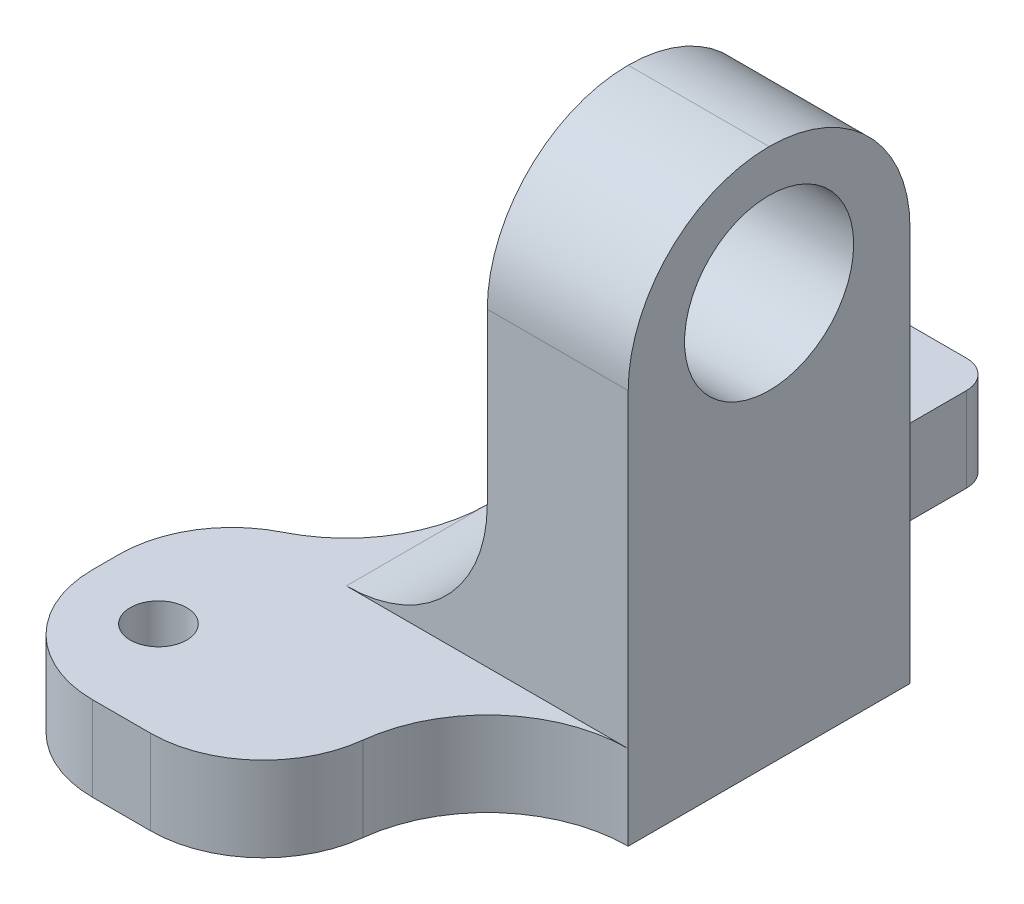
ISO-10303-21;
HEADER;
FILE_DESCRIPTION(('STEP AP214'),'2;1');
FILE_NAME('part.step','',(''),(''),'','','');
FILE_SCHEMA(('AUTOMOTIVE_DESIGN { 1 0 10303 214 1 1 1 1 }'));
ENDSEC;
DATA;
#1=APPLICATION_CONTEXT('core data for automotive mechanical design processes');
#2=APPLICATION_PROTOCOL_DEFINITION('international standard','automotive_design',2000,#1);
#3=PRODUCT_CONTEXT('',#1,'mechanical');
#4=PRODUCT('Part','Part','',(#3));
#5=PRODUCT_RELATED_PRODUCT_CATEGORY('part','',(#4));
#6=PRODUCT_DEFINITION_FORMATION('','',#4);
#7=PRODUCT_DEFINITION_CONTEXT('part definition',#1,'design');
#8=PRODUCT_DEFINITION('design','',#6,#7);
#9=PRODUCT_DEFINITION_SHAPE('','',#8);
#10=(LENGTH_UNIT() NAMED_UNIT(*) SI_UNIT(.MILLI.,.METRE.));
#11=(NAMED_UNIT(*) PLANE_ANGLE_UNIT() SI_UNIT($,.RADIAN.));
#12=(NAMED_UNIT(*) SI_UNIT($,.STERADIAN.) SOLID_ANGLE_UNIT());
#13=UNCERTAINTY_MEASURE_WITH_UNIT(LENGTH_MEASURE(1.E-05),#10,'distance_accuracy_value','');
#14=(GEOMETRIC_REPRESENTATION_CONTEXT(3) GLOBAL_UNCERTAINTY_ASSIGNED_CONTEXT((#13)) GLOBAL_UNIT_ASSIGNED_CONTEXT((#10,
#11,#12)) REPRESENTATION_CONTEXT('',''));
#15=CARTESIAN_POINT('',(0.,0.,0.));
#16=DIRECTION('',(0.,0.,1.));
#17=DIRECTION('',(1.,0.,0.));
#18=AXIS2_PLACEMENT_3D('',#15,#16,#17);
#19=CARTESIAN_POINT('',(0.,3.,0.));
#20=DIRECTION('',(0.,1.,0.));
#21=DIRECTION('',(0.,0.,1.));
#22=AXIS2_PLACEMENT_3D('',#19,#20,#21);
#23=PLANE('',#22);
#24=CARTESIAN_POINT('',(-32.6666666666662,3.,9.5));
#25=DIRECTION('',(0.,1.,0.));
#26=DIRECTION('',(0.,0.,1.));
#27=AXIS2_PLACEMENT_3D('',#24,#25,#26);
#28=CIRCLE('',#27,0.999999999999998);
#29=CARTESIAN_POINT('',(-32.6666666666662,3.,10.5));
#30=VERTEX_POINT('',#29);
#31=EDGE_CURVE('E351',#30,#30,#28,.T.);
#32=ORIENTED_EDGE('',*,*,#31,.F.);
#33=EDGE_LOOP('',(#32));
#34=FACE_BOUND('',#33,.T.);
#35=CARTESIAN_POINT('',(-35.500171023445,3.,0.));
#36=DIRECTION('',(0.,1.,0.));
#37=DIRECTION('',(0.,0.,1.));
#38=AXIS2_PLACEMENT_3D('',#35,#36,#37);
#39=CIRCLE('',#38,5.);
#40=CARTESIAN_POINT('',(-30.500171023445,3.,0.));
#41=VERTEX_POINT('',#40);
#42=CARTESIAN_POINT('',(-33.2779488012228,3.,4.47903208238808));
#43=VERTEX_POINT('',#42);
#44=EDGE_CURVE('E204',#41,#43,#39,.F.);
#45=ORIENTED_EDGE('',*,*,#44,.T.);
#46=CARTESIAN_POINT('',(-31.500171023445,3.,8.06225774829855));
#47=DIRECTION('',(0.,1.,0.));
#48=DIRECTION('',(0.,0.,1.));
#49=AXIS2_PLACEMENT_3D('',#46,#47,#48);
#50=CIRCLE('',#49,4.);
#51=CARTESIAN_POINT('',(-35.500171023445,3.,8.06225774829855));
#52=VERTEX_POINT('',#51);
#53=EDGE_CURVE('E223',#43,#52,#50,.T.);
#54=ORIENTED_EDGE('',*,*,#53,.T.);
#55=DIRECTION('',(0.,0.,-1.));
#56=VECTOR('',#55,1.);
#57=CARTESIAN_POINT('',(-35.500171023445,3.,13.));
#58=LINE('',#57,#56);
#59=CARTESIAN_POINT('',(-35.500171023445,3.,9.));
#60=VERTEX_POINT('',#59);
#61=EDGE_CURVE('E283',#60,#52,#58,.T.);
#62=ORIENTED_EDGE('',*,*,#61,.F.);
#63=CARTESIAN_POINT('',(-31.500171023445,3.,9.));
#64=DIRECTION('',(0.,1.,0.));
#65=DIRECTION('',(0.,0.,1.));
#66=AXIS2_PLACEMENT_3D('',#63,#64,#65);
#67=CIRCLE('',#66,4.);
#68=CARTESIAN_POINT('',(-31.500171023445,3.,13.));
#69=VERTEX_POINT('',#68);
#70=EDGE_CURVE('E221',#60,#69,#67,.T.);
#71=ORIENTED_EDGE('',*,*,#70,.T.);
#72=DIRECTION('',(1.,0.,0.));
#73=VECTOR('',#72,1.);
#74=CARTESIAN_POINT('',(-35.500171023445,3.,13.));
#75=LINE('',#74,#73);
#76=CARTESIAN_POINT('',(-29.4444429334442,3.,13.));
#77=VERTEX_POINT('',#76);
#78=EDGE_CURVE('E279',#69,#77,#75,.T.);
#79=ORIENTED_EDGE('',*,*,#78,.T.);
#80=CARTESIAN_POINT('',(-29.4444429334442,3.,9.));
#81=DIRECTION('',(0.,1.,0.));
#82=DIRECTION('',(0.,0.,1.));
#83=AXIS2_PLACEMENT_3D('',#80,#81,#82);
#84=CIRCLE('',#83,4.);
#85=CARTESIAN_POINT('',(-25.4692109734446,3.,9.44444444444444));
#86=VERTEX_POINT('',#85);
#87=EDGE_CURVE('E219',#77,#86,#84,.T.);
#88=ORIENTED_EDGE('',*,*,#87,.T.);
#89=CARTESIAN_POINT('',(-20.500171023445,3.,10.));
#90=DIRECTION('',(0.,1.,0.));
#91=DIRECTION('',(0.,0.,1.));
#92=AXIS2_PLACEMENT_3D('',#89,#90,#91);
#93=CIRCLE('',#92,5.);
#94=CARTESIAN_POINT('',(-20.500171023445,3.,5.));
#95=VERTEX_POINT('',#94);
#96=EDGE_CURVE('E192',#86,#95,#93,.F.);
#97=ORIENTED_EDGE('',*,*,#96,.T.);
#98=DIRECTION('',(-1.,0.,0.));
#99=VECTOR('',#98,1.);
#100=CARTESIAN_POINT('',(0.,3.,5.00000000000001));
#101=LINE('',#100,#99);
#102=CARTESIAN_POINT('',(-30.500171023445,3.,5.));
#103=VERTEX_POINT('',#102);
#104=EDGE_CURVE('E185',#95,#103,#101,.T.);
#105=ORIENTED_EDGE('',*,*,#104,.T.);
#106=DIRECTION('',(0.,0.,1.));
#107=VECTOR('',#106,1.);
#108=CARTESIAN_POINT('',(-30.500171023445,3.,2.5));
#109=LINE('',#108,#107);
#110=EDGE_CURVE('E165',#103,#41,#109,.F.);
#111=ORIENTED_EDGE('',*,*,#110,.T.);
#112=EDGE_LOOP('',(#45,#54,#62,#71,#79,#88,#97,#105,#111));
#113=FACE_BOUND('',#112,.T.);
#114=ADVANCED_FACE('F33',(#34,#113),#23,.T.);
#115=CARTESIAN_POINT('',(-35.500171023445,3.,-13.));
#116=DIRECTION('',(0.,0.,-1.));
#117=DIRECTION('',(-1.,0.,0.));
#118=AXIS2_PLACEMENT_3D('',#115,#116,#117);
#119=PLANE('',#118);
#120=DIRECTION('',(1.,0.,0.));
#121=VECTOR('',#120,1.);
#122=CARTESIAN_POINT('',(-35.500171023445,3.,-13.));
#123=LINE('',#122,#121);
#124=CARTESIAN_POINT('',(-29.500171023445,3.,-13.));
#125=VERTEX_POINT('',#124);
#126=CARTESIAN_POINT('',(-26.500171023445,3.,-13.));
#127=VERTEX_POINT('',#126);
#128=EDGE_CURVE('E276',#125,#127,#123,.T.);
#129=ORIENTED_EDGE('',*,*,#128,.T.);
#130=DIRECTION('',(0.,1.,0.));
#131=VECTOR('',#130,1.);
#132=CARTESIAN_POINT('',(-26.500171023445,0.,-13.));
#133=LINE('',#132,#131);
#134=CARTESIAN_POINT('',(-26.500171023445,0.,-13.));
#135=VERTEX_POINT('',#134);
#136=EDGE_CURVE('E54',#127,#135,#133,.F.);
#137=ORIENTED_EDGE('',*,*,#136,.T.);
#138=DIRECTION('',(1.,0.,0.));
#139=VECTOR('',#138,1.);
#140=CARTESIAN_POINT('',(-35.500171023445,0.,-13.));
#141=LINE('',#140,#139);
#142=CARTESIAN_POINT('',(-29.500171023445,0.,-13.));
#143=VERTEX_POINT('',#142);
#144=EDGE_CURVE('E262',#143,#135,#141,.T.);
#145=ORIENTED_EDGE('',*,*,#144,.F.);
#146=DIRECTION('',(0.,1.,0.));
#147=VECTOR('',#146,1.);
#148=CARTESIAN_POINT('',(-29.500171023445,3.,-13.));
#149=LINE('',#148,#147);
#150=EDGE_CURVE('E250',#143,#125,#149,.T.);
#151=ORIENTED_EDGE('',*,*,#150,.T.);
#152=EDGE_LOOP('',(#129,#137,#145,#151));
#153=FACE_BOUND('',#152,.T.);
#154=ADVANCED_FACE('F277',(#153),#119,.T.);
#155=CARTESIAN_POINT('',(-35.500171023445,3.,13.));
#156=DIRECTION('',(-1.,0.,0.));
#157=DIRECTION('',(0.,0.,1.));
#158=AXIS2_PLACEMENT_3D('',#155,#156,#157);
#159=PLANE('',#158);
#160=ORIENTED_EDGE('',*,*,#61,.T.);
#161=DIRECTION('',(0.,1.,0.));
#162=VECTOR('',#161,1.);
#163=CARTESIAN_POINT('',(-35.500171023445,0.,8.06225774829855));
#164=LINE('',#163,#162);
#165=CARTESIAN_POINT('',(-35.500171023445,0.,8.06225774829855));
#166=VERTEX_POINT('',#165);
#167=EDGE_CURVE('E227',#52,#166,#164,.F.);
#168=ORIENTED_EDGE('',*,*,#167,.T.);
#169=DIRECTION('',(0.,0.,-1.));
#170=VECTOR('',#169,1.);
#171=CARTESIAN_POINT('',(-35.500171023445,0.,13.));
#172=LINE('',#171,#170);
#173=CARTESIAN_POINT('',(-35.500171023445,0.,9.));
#174=VERTEX_POINT('',#173);
#175=EDGE_CURVE('E280',#174,#166,#172,.T.);
#176=ORIENTED_EDGE('',*,*,#175,.F.);
#177=DIRECTION('',(0.,-1.,0.));
#178=VECTOR('',#177,1.);
#179=CARTESIAN_POINT('',(-35.500171023445,3.,9.));
#180=LINE('',#179,#178);
#181=EDGE_CURVE('E225',#174,#60,#180,.F.);
#182=ORIENTED_EDGE('',*,*,#181,.T.);
#183=EDGE_LOOP('',(#160,#168,#176,#182));
#184=FACE_BOUND('',#183,.T.);
#185=ADVANCED_FACE('F381',(#184),#159,.T.);
#186=CARTESIAN_POINT('',(-35.500171023445,3.,13.));
#187=DIRECTION('',(0.,0.,-1.));
#188=DIRECTION('',(-1.,0.,0.));
#189=AXIS2_PLACEMENT_3D('',#186,#187,#188);
#190=PLANE('',#189);
#191=ORIENTED_EDGE('',*,*,#78,.F.);
#192=DIRECTION('',(0.,-1.,0.));
#193=VECTOR('',#192,1.);
#194=CARTESIAN_POINT('',(-31.500171023445,0.,13.));
#195=LINE('',#194,#193);
#196=CARTESIAN_POINT('',(-31.500171023445,0.,13.));
#197=VERTEX_POINT('',#196);
#198=EDGE_CURVE('E238',#69,#197,#195,.T.);
#199=ORIENTED_EDGE('',*,*,#198,.T.);
#200=DIRECTION('',(1.,0.,0.));
#201=VECTOR('',#200,1.);
#202=CARTESIAN_POINT('',(-35.500171023445,0.,13.));
#203=LINE('',#202,#201);
#204=CARTESIAN_POINT('',(-29.4444429334442,0.,13.));
#205=VERTEX_POINT('',#204);
#206=EDGE_CURVE('E286',#197,#205,#203,.T.);
#207=ORIENTED_EDGE('',*,*,#206,.T.);
#208=DIRECTION('',(0.,-1.,0.));
#209=VECTOR('',#208,1.);
#210=CARTESIAN_POINT('',(-29.4444429334442,3.,13.));
#211=LINE('',#210,#209);
#212=EDGE_CURVE('E235',#205,#77,#211,.F.);
#213=ORIENTED_EDGE('',*,*,#212,.T.);
#214=EDGE_LOOP('',(#191,#199,#207,#213));
#215=FACE_BOUND('',#214,.T.);
#216=ADVANCED_FACE('F464',(#215),#190,.F.);
#217=CARTESIAN_POINT('',(-20.500171023445,3.,13.));
#218=DIRECTION('',(-1.,0.,0.));
#219=DIRECTION('',(0.,0.,1.));
#220=AXIS2_PLACEMENT_3D('',#217,#218,#219);
#221=PLANE('',#220);
#222=CARTESIAN_POINT('',(-20.500171023445,14.5,0.));
#223=DIRECTION('',(1.,0.,0.));
#224=DIRECTION('',(0.,0.,-1.));
#225=AXIS2_PLACEMENT_3D('',#222,#223,#224);
#226=CIRCLE('',#225,3.);
#227=CARTESIAN_POINT('',(-20.500171023445,14.5,-3.));
#228=VERTEX_POINT('',#227);
#229=EDGE_CURVE('E337',#228,#228,#226,.T.);
#230=ORIENTED_EDGE('',*,*,#229,.F.);
#231=EDGE_LOOP('',(#230));
#232=FACE_BOUND('',#231,.T.);
#233=DIRECTION('',(0.,-1.,0.));
#234=VECTOR('',#233,1.);
#235=CARTESIAN_POINT('',(-20.500171023445,19.,-5.));
#236=LINE('',#235,#234);
#237=CARTESIAN_POINT('',(-20.500171023445,14.,-5.));
#238=VERTEX_POINT('',#237);
#239=CARTESIAN_POINT('',(-20.500171023445,3.,-5.));
#240=VERTEX_POINT('',#239);
#241=EDGE_CURVE('E330',#238,#240,#236,.T.);
#242=ORIENTED_EDGE('',*,*,#241,.F.);
#243=CARTESIAN_POINT('',(-20.500171023445,14.,0.));
#244=DIRECTION('',(-1.,0.,0.));
#245=DIRECTION('',(0.,0.,1.));
#246=AXIS2_PLACEMENT_3D('',#243,#244,#245);
#247=CIRCLE('',#246,5.);
#248=CARTESIAN_POINT('',(-20.500171023445,19.,0.));
#249=VERTEX_POINT('',#248);
#250=EDGE_CURVE('E310',#238,#249,#247,.F.);
#251=ORIENTED_EDGE('',*,*,#250,.T.);
#252=CARTESIAN_POINT('',(-20.500171023445,14.,0.));
#253=DIRECTION('',(-1.,0.,0.));
#254=DIRECTION('',(0.,0.,1.));
#255=AXIS2_PLACEMENT_3D('',#252,#253,#254);
#256=CIRCLE('',#255,5.);
#257=CARTESIAN_POINT('',(-20.500171023445,14.,5.));
#258=VERTEX_POINT('',#257);
#259=EDGE_CURVE('E308',#249,#258,#256,.F.);
#260=ORIENTED_EDGE('',*,*,#259,.T.);
#261=DIRECTION('',(0.,-1.,0.));
#262=VECTOR('',#261,1.);
#263=CARTESIAN_POINT('',(-20.500171023445,19.,5.));
#264=LINE('',#263,#262);
#265=EDGE_CURVE('E344',#258,#95,#264,.T.);
#266=ORIENTED_EDGE('',*,*,#265,.T.);
#267=CARTESIAN_POINT('',(-20.500171023445,0.,5.));
#268=VERTEX_POINT('',#267);
#269=EDGE_CURVE('E343',#95,#268,#264,.T.);
#270=ORIENTED_EDGE('',*,*,#269,.T.);
#271=DIRECTION('',(0.,0.,-1.));
#272=VECTOR('',#271,1.);
#273=CARTESIAN_POINT('',(-20.500171023445,0.,13.));
#274=LINE('',#273,#272);
#275=CARTESIAN_POINT('',(-20.500171023445,0.,-5.));
#276=VERTEX_POINT('',#275);
#277=EDGE_CURVE('E296',#268,#276,#274,.T.);
#278=ORIENTED_EDGE('',*,*,#277,.T.);
#279=EDGE_CURVE('E348',#240,#276,#236,.T.);
#280=ORIENTED_EDGE('',*,*,#279,.F.);
#281=EDGE_LOOP('',(#242,#251,#260,#266,#270,#278,#280));
#282=FACE_BOUND('',#281,.T.);
#283=ADVANCED_FACE('F372',(#232,#282),#221,.F.);
#284=DIRECTION('',(0.,0.,1.));
#285=VECTOR('',#284,1.);
#286=CARTESIAN_POINT('',(-25.500171023445,3.,-13.));
#287=LINE('',#286,#285);
#288=CARTESIAN_POINT('',(-25.500171023445,3.,-12.));
#289=VERTEX_POINT('',#288);
#290=CARTESIAN_POINT('',(-25.500171023445,3.,-10.));
#291=VERTEX_POINT('',#290);
#292=EDGE_CURVE('E269',#289,#291,#287,.T.);
#293=ORIENTED_EDGE('',*,*,#292,.F.);
#294=CARTESIAN_POINT('',(-26.500171023445,3.,-12.));
#295=DIRECTION('',(0.,1.,0.));
#296=DIRECTION('',(0.,0.,1.));
#297=AXIS2_PLACEMENT_3D('',#294,#295,#296);
#298=CIRCLE('',#297,1.);
#299=EDGE_CURVE('E248',#289,#127,#298,.T.);
#300=ORIENTED_EDGE('',*,*,#299,.T.);
#301=ORIENTED_EDGE('',*,*,#128,.F.);
#302=CARTESIAN_POINT('',(-29.500171023445,3.,-12.));
#303=DIRECTION('',(0.,1.,0.));
#304=DIRECTION('',(0.,0.,1.));
#305=AXIS2_PLACEMENT_3D('',#302,#303,#304);
#306=CIRCLE('',#305,1.);
#307=CARTESIAN_POINT('',(-30.500171023445,3.,-12.));
#308=VERTEX_POINT('',#307);
#309=EDGE_CURVE('E246',#125,#308,#306,.T.);
#310=ORIENTED_EDGE('',*,*,#309,.T.);
#311=DIRECTION('',(0.,0.,-1.));
#312=VECTOR('',#311,1.);
#313=CARTESIAN_POINT('',(-30.500171023445,3.,-13.));
#314=LINE('',#313,#312);
#315=CARTESIAN_POINT('',(-30.500171023445,3.,-5.));
#316=VERTEX_POINT('',#315);
#317=EDGE_CURVE('E332',#316,#308,#314,.T.);
#318=ORIENTED_EDGE('',*,*,#317,.F.);
#319=DIRECTION('',(1.,0.,0.));
#320=VECTOR('',#319,1.);
#321=CARTESIAN_POINT('',(0.,3.,-5.));
#322=LINE('',#321,#320);
#323=EDGE_CURVE('E193',#316,#240,#322,.T.);
#324=ORIENTED_EDGE('',*,*,#323,.T.);
#325=CARTESIAN_POINT('',(-20.500171023445,3.,-10.));
#326=DIRECTION('',(0.,1.,0.));
#327=DIRECTION('',(0.,0.,1.));
#328=AXIS2_PLACEMENT_3D('',#325,#326,#327);
#329=CIRCLE('',#328,5.);
#330=EDGE_CURVE('E209',#240,#291,#329,.F.);
#331=ORIENTED_EDGE('',*,*,#330,.T.);
#332=EDGE_LOOP('',(#293,#300,#301,#310,#318,#324,#331));
#333=FACE_BOUND('',#332,.T.);
#334=CARTESIAN_POINT('',(-27.9999999999996,3.,-10.5));
#335=DIRECTION('',(0.,1.,0.));
#336=DIRECTION('',(0.,0.,1.));
#337=AXIS2_PLACEMENT_3D('',#334,#335,#336);
#338=CIRCLE('',#337,1.);
#339=CARTESIAN_POINT('',(-27.9999999999996,3.,-9.5));
#340=VERTEX_POINT('',#339);
#341=EDGE_CURVE('E350',#340,#340,#338,.T.);
#342=ORIENTED_EDGE('',*,*,#341,.F.);
#343=EDGE_LOOP('',(#342));
#344=FACE_BOUND('',#343,.T.);
#345=ADVANCED_FACE('F274',(#333,#344),#23,.T.);
#346=CARTESIAN_POINT('',(0.,0.,0.));
#347=DIRECTION('',(0.,1.,0.));
#348=DIRECTION('',(0.,0.,1.));
#349=AXIS2_PLACEMENT_3D('',#346,#347,#348);
#350=PLANE('',#349);
#351=CARTESIAN_POINT('',(-32.6666666666662,0.,9.5));
#352=DIRECTION('',(0.,1.,0.));
#353=DIRECTION('',(0.,0.,1.));
#354=AXIS2_PLACEMENT_3D('',#351,#352,#353);
#355=CIRCLE('',#354,0.999999999999998);
#356=CARTESIAN_POINT('',(-32.6666666666662,0.,10.5));
#357=VERTEX_POINT('',#356);
#358=EDGE_CURVE('E297',#357,#357,#355,.F.);
#359=ORIENTED_EDGE('',*,*,#358,.F.);
#360=EDGE_LOOP('',(#359));
#361=FACE_BOUND('',#360,.T.);
#362=CARTESIAN_POINT('',(-27.9999999999996,0.,-10.5));
#363=DIRECTION('',(0.,1.,0.));
#364=DIRECTION('',(0.,0.,1.));
#365=AXIS2_PLACEMENT_3D('',#362,#363,#364);
#366=CIRCLE('',#365,1.);
#367=CARTESIAN_POINT('',(-27.9999999999996,0.,-9.5));
#368=VERTEX_POINT('',#367);
#369=EDGE_CURVE('E289',#368,#368,#366,.F.);
#370=ORIENTED_EDGE('',*,*,#369,.F.);
#371=EDGE_LOOP('',(#370));
#372=FACE_BOUND('',#371,.T.);
#373=ORIENTED_EDGE('',*,*,#144,.T.);
#374=CARTESIAN_POINT('',(-26.500171023445,0.,-12.));
#375=DIRECTION('',(0.,1.,0.));
#376=DIRECTION('',(0.,0.,1.));
#377=AXIS2_PLACEMENT_3D('',#374,#375,#376);
#378=CIRCLE('',#377,1.);
#379=CARTESIAN_POINT('',(-25.500171023445,0.,-12.));
#380=VERTEX_POINT('',#379);
#381=EDGE_CURVE('E41',#135,#380,#378,.F.);
#382=ORIENTED_EDGE('',*,*,#381,.T.);
#383=DIRECTION('',(0.,0.,-1.));
#384=VECTOR('',#383,1.);
#385=CARTESIAN_POINT('',(-25.500171023445,0.,-13.));
#386=LINE('',#385,#384);
#387=CARTESIAN_POINT('',(-25.500171023445,0.,-10.));
#388=VERTEX_POINT('',#387);
#389=EDGE_CURVE('E260',#388,#380,#386,.T.);
#390=ORIENTED_EDGE('',*,*,#389,.F.);
#391=CARTESIAN_POINT('',(-20.500171023445,0.,-10.));
#392=DIRECTION('',(0.,1.,0.));
#393=DIRECTION('',(0.,0.,1.));
#394=AXIS2_PLACEMENT_3D('',#391,#392,#393);
#395=CIRCLE('',#394,5.);
#396=EDGE_CURVE('E212',#388,#276,#395,.T.);
#397=ORIENTED_EDGE('',*,*,#396,.T.);
#398=ORIENTED_EDGE('',*,*,#277,.F.);
#399=CARTESIAN_POINT('',(-20.500171023445,0.,10.));
#400=DIRECTION('',(0.,1.,0.));
#401=DIRECTION('',(0.,0.,1.));
#402=AXIS2_PLACEMENT_3D('',#399,#400,#401);
#403=CIRCLE('',#402,5.);
#404=CARTESIAN_POINT('',(-25.4692109734446,0.,9.44444444444444));
#405=VERTEX_POINT('',#404);
#406=EDGE_CURVE('E178',#268,#405,#403,.T.);
#407=ORIENTED_EDGE('',*,*,#406,.T.);
#408=CARTESIAN_POINT('',(-29.4444429334442,0.,9.));
#409=DIRECTION('',(0.,1.,0.));
#410=DIRECTION('',(0.,0.,1.));
#411=AXIS2_PLACEMENT_3D('',#408,#409,#410);
#412=CIRCLE('',#411,4.);
#413=EDGE_CURVE('E229',#405,#205,#412,.F.);
#414=ORIENTED_EDGE('',*,*,#413,.T.);
#415=ORIENTED_EDGE('',*,*,#206,.F.);
#416=CARTESIAN_POINT('',(-31.500171023445,0.,9.));
#417=DIRECTION('',(0.,1.,0.));
#418=DIRECTION('',(0.,0.,1.));
#419=AXIS2_PLACEMENT_3D('',#416,#417,#418);
#420=CIRCLE('',#419,4.);
#421=EDGE_CURVE('E231',#197,#174,#420,.F.);
#422=ORIENTED_EDGE('',*,*,#421,.T.);
#423=ORIENTED_EDGE('',*,*,#175,.T.);
#424=CARTESIAN_POINT('',(-31.500171023445,0.,8.06225774829855));
#425=DIRECTION('',(0.,1.,0.));
#426=DIRECTION('',(0.,0.,1.));
#427=AXIS2_PLACEMENT_3D('',#424,#425,#426);
#428=CIRCLE('',#427,4.);
#429=CARTESIAN_POINT('',(-33.2779488012228,0.,4.47903208238808));
#430=VERTEX_POINT('',#429);
#431=EDGE_CURVE('E233',#166,#430,#428,.F.);
#432=ORIENTED_EDGE('',*,*,#431,.T.);
#433=CARTESIAN_POINT('',(-35.500171023445,0.,0.));
#434=DIRECTION('',(0.,1.,0.));
#435=DIRECTION('',(0.,0.,1.));
#436=AXIS2_PLACEMENT_3D('',#433,#434,#435);
#437=CIRCLE('',#436,5.);
#438=CARTESIAN_POINT('',(-30.500171023445,0.,0.));
#439=VERTEX_POINT('',#438);
#440=EDGE_CURVE('E206',#430,#439,#437,.T.);
#441=ORIENTED_EDGE('',*,*,#440,.T.);
#442=DIRECTION('',(0.,0.,1.));
#443=VECTOR('',#442,1.);
#444=CARTESIAN_POINT('',(-30.500171023445,0.,-13.));
#445=LINE('',#444,#443);
#446=CARTESIAN_POINT('',(-30.500171023445,0.,-12.));
#447=VERTEX_POINT('',#446);
#448=EDGE_CURVE('E316',#447,#439,#445,.T.);
#449=ORIENTED_EDGE('',*,*,#448,.F.);
#450=CARTESIAN_POINT('',(-29.500171023445,0.,-12.));
#451=DIRECTION('',(0.,1.,0.));
#452=DIRECTION('',(0.,0.,1.));
#453=AXIS2_PLACEMENT_3D('',#450,#451,#452);
#454=CIRCLE('',#453,1.);
#455=EDGE_CURVE('E254',#447,#143,#454,.F.);
#456=ORIENTED_EDGE('',*,*,#455,.T.);
#457=EDGE_LOOP('',(#373,#382,#390,#397,#398,#407,#414,#415,#422,#423,#432,#441,#449,#456));
#458=FACE_BOUND('',#457,.T.);
#459=ADVANCED_FACE('F259',(#361,#372,#458),#350,.F.);
#460=CARTESIAN_POINT('',(-27.9999999999996,-0.00100000000000057,-10.5));
#461=DIRECTION('',(0.,1.,0.));
#462=DIRECTION('',(0.,0.,1.));
#463=AXIS2_PLACEMENT_3D('',#460,#461,#462);
#464=CYLINDRICAL_SURFACE('',#463,1.);
#465=ORIENTED_EDGE('',*,*,#341,.T.);
#466=EDGE_LOOP('',(#465));
#467=FACE_BOUND('',#466,.T.);
#468=ORIENTED_EDGE('',*,*,#369,.T.);
#469=EDGE_LOOP('',(#468));
#470=FACE_BOUND('',#469,.T.);
#471=ADVANCED_FACE('F361',(#467,#470),#464,.F.);
#472=CARTESIAN_POINT('',(-32.6666666666662,-0.00100000000000143,9.5));
#473=DIRECTION('',(0.,1.,0.));
#474=DIRECTION('',(0.,0.,1.));
#475=AXIS2_PLACEMENT_3D('',#472,#473,#474);
#476=CYLINDRICAL_SURFACE('',#475,0.999999999999998);
#477=ORIENTED_EDGE('',*,*,#31,.T.);
#478=EDGE_LOOP('',(#477));
#479=FACE_BOUND('',#478,.T.);
#480=ORIENTED_EDGE('',*,*,#358,.T.);
#481=EDGE_LOOP('',(#480));
#482=FACE_BOUND('',#481,.T.);
#483=ADVANCED_FACE('F370',(#479,#482),#476,.F.);
#484=CARTESIAN_POINT('',(-20.500171023445,19.,-5.));
#485=DIRECTION('',(0.,0.,1.));
#486=DIRECTION('',(1.,0.,0.));
#487=AXIS2_PLACEMENT_3D('',#484,#485,#486);
#488=PLANE('',#487);
#489=ORIENTED_EDGE('',*,*,#241,.T.);
#490=ORIENTED_EDGE('',*,*,#323,.F.);
#491=CARTESIAN_POINT('',(-30.500171023445,8.,-5.));
#492=DIRECTION('',(0.,0.,1.));
#493=DIRECTION('',(1.,0.,0.));
#494=AXIS2_PLACEMENT_3D('',#491,#492,#493);
#495=CIRCLE('',#494,5.);
#496=CARTESIAN_POINT('',(-25.500171023445,8.,-5.));
#497=VERTEX_POINT('',#496);
#498=EDGE_CURVE('E189',#316,#497,#495,.T.);
#499=ORIENTED_EDGE('',*,*,#498,.T.);
#500=DIRECTION('',(0.,-1.,0.));
#501=VECTOR('',#500,1.);
#502=CARTESIAN_POINT('',(-25.500171023445,19.,-5.));
#503=LINE('',#502,#501);
#504=CARTESIAN_POINT('',(-25.500171023445,14.,-5.));
#505=VERTEX_POINT('',#504);
#506=EDGE_CURVE('E322',#505,#497,#503,.T.);
#507=ORIENTED_EDGE('',*,*,#506,.F.);
#508=DIRECTION('',(-1.,0.,0.));
#509=VECTOR('',#508,1.);
#510=CARTESIAN_POINT('',(-20.500171023445,14.,-5.));
#511=LINE('',#510,#509);
#512=EDGE_CURVE('E305',#505,#238,#511,.F.);
#513=ORIENTED_EDGE('',*,*,#512,.T.);
#514=EDGE_LOOP('',(#489,#490,#499,#507,#513));
#515=FACE_BOUND('',#514,.T.);
#516=ADVANCED_FACE('F326',(#515),#488,.F.);
#517=CARTESIAN_POINT('',(-25.500171023445,19.,-5.));
#518=DIRECTION('',(1.,0.,0.));
#519=DIRECTION('',(0.,0.,-1.));
#520=AXIS2_PLACEMENT_3D('',#517,#518,#519);
#521=PLANE('',#520);
#522=CARTESIAN_POINT('',(-25.500171023445,14.5,0.));
#523=DIRECTION('',(1.,0.,0.));
#524=DIRECTION('',(0.,0.,-1.));
#525=AXIS2_PLACEMENT_3D('',#522,#523,#524);
#526=CIRCLE('',#525,3.);
#527=CARTESIAN_POINT('',(-25.500171023445,14.5,-3.));
#528=VERTEX_POINT('',#527);
#529=EDGE_CURVE('E340',#528,#528,#526,.F.);
#530=ORIENTED_EDGE('',*,*,#529,.F.);
#531=EDGE_LOOP('',(#530));
#532=FACE_BOUND('',#531,.T.);
#533=ORIENTED_EDGE('',*,*,#506,.T.);
#534=DIRECTION('',(0.,0.,1.));
#535=VECTOR('',#534,1.);
#536=CARTESIAN_POINT('',(-25.500171023445,8.,-5.));
#537=LINE('',#536,#535);
#538=CARTESIAN_POINT('',(-25.500171023445,8.,5.));
#539=VERTEX_POINT('',#538);
#540=EDGE_CURVE('E195',#497,#539,#537,.T.);
#541=ORIENTED_EDGE('',*,*,#540,.T.);
#542=DIRECTION('',(0.,-1.,0.));
#543=VECTOR('',#542,1.);
#544=CARTESIAN_POINT('',(-25.500171023445,19.,5.));
#545=LINE('',#544,#543);
#546=CARTESIAN_POINT('',(-25.500171023445,14.,5.));
#547=VERTEX_POINT('',#546);
#548=EDGE_CURVE('E188',#547,#539,#545,.T.);
#549=ORIENTED_EDGE('',*,*,#548,.F.);
#550=CARTESIAN_POINT('',(-25.500171023445,14.,0.));
#551=DIRECTION('',(1.,0.,0.));
#552=DIRECTION('',(0.,0.,-1.));
#553=AXIS2_PLACEMENT_3D('',#550,#551,#552);
#554=CIRCLE('',#553,5.);
#555=CARTESIAN_POINT('',(-25.500171023445,19.,0.));
#556=VERTEX_POINT('',#555);
#557=EDGE_CURVE('E294',#547,#556,#554,.F.);
#558=ORIENTED_EDGE('',*,*,#557,.T.);
#559=CARTESIAN_POINT('',(-25.500171023445,14.,0.));
#560=DIRECTION('',(1.,0.,0.));
#561=DIRECTION('',(0.,0.,-1.));
#562=AXIS2_PLACEMENT_3D('',#559,#560,#561);
#563=CIRCLE('',#562,5.);
#564=EDGE_CURVE('E303',#556,#505,#563,.F.);
#565=ORIENTED_EDGE('',*,*,#564,.T.);
#566=EDGE_LOOP('',(#533,#541,#549,#558,#565));
#567=FACE_BOUND('',#566,.T.);
#568=ADVANCED_FACE('F319',(#532,#567),#521,.F.);
#569=CARTESIAN_POINT('',(-20.500171023445,19.,5.));
#570=DIRECTION('',(0.,0.,-1.));
#571=DIRECTION('',(-1.,0.,0.));
#572=AXIS2_PLACEMENT_3D('',#569,#570,#571);
#573=PLANE('',#572);
#574=ORIENTED_EDGE('',*,*,#104,.F.);
#575=ORIENTED_EDGE('',*,*,#265,.F.);
#576=DIRECTION('',(1.,0.,0.));
#577=VECTOR('',#576,1.);
#578=CARTESIAN_POINT('',(-20.500171023445,14.,5.));
#579=LINE('',#578,#577);
#580=EDGE_CURVE('E312',#258,#547,#579,.F.);
#581=ORIENTED_EDGE('',*,*,#580,.T.);
#582=ORIENTED_EDGE('',*,*,#548,.T.);
#583=CARTESIAN_POINT('',(-30.500171023445,8.,5.));
#584=DIRECTION('',(0.,0.,-1.));
#585=DIRECTION('',(-1.,0.,0.));
#586=AXIS2_PLACEMENT_3D('',#583,#584,#585);
#587=CIRCLE('',#586,5.);
#588=EDGE_CURVE('E170',#539,#103,#587,.T.);
#589=ORIENTED_EDGE('',*,*,#588,.T.);
#590=EDGE_LOOP('',(#574,#575,#581,#582,#589));
#591=FACE_BOUND('',#590,.T.);
#592=ADVANCED_FACE('F183',(#591),#573,.F.);
#593=CARTESIAN_POINT('',(-35.501171023445,14.5,0.));
#594=DIRECTION('',(1.,0.,0.));
#595=DIRECTION('',(0.,0.,-1.));
#596=AXIS2_PLACEMENT_3D('',#593,#594,#595);
#597=CYLINDRICAL_SURFACE('',#596,3.);
#598=ORIENTED_EDGE('',*,*,#229,.T.);
#599=EDGE_LOOP('',(#598));
#600=FACE_BOUND('',#599,.T.);
#601=ORIENTED_EDGE('',*,*,#529,.T.);
#602=EDGE_LOOP('',(#601));
#603=FACE_BOUND('',#602,.T.);
#604=ADVANCED_FACE('F395',(#600,#603),#597,.F.);
#605=CARTESIAN_POINT('',(-25.500171023445,-0.00100000000000013,-13.));
#606=DIRECTION('',(-1.,0.,0.));
#607=DIRECTION('',(0.,0.,1.));
#608=AXIS2_PLACEMENT_3D('',#605,#606,#607);
#609=PLANE('',#608);
#610=ORIENTED_EDGE('',*,*,#389,.T.);
#611=DIRECTION('',(0.,1.,0.));
#612=VECTOR('',#611,1.);
#613=CARTESIAN_POINT('',(-25.500171023445,3.,-12.));
#614=LINE('',#613,#612);
#615=EDGE_CURVE('E243',#380,#289,#614,.T.);
#616=ORIENTED_EDGE('',*,*,#615,.T.);
#617=ORIENTED_EDGE('',*,*,#292,.T.);
#618=DIRECTION('',(0.,1.,0.));
#619=VECTOR('',#618,1.);
#620=CARTESIAN_POINT('',(-25.500171023445,0.,-10.));
#621=LINE('',#620,#619);
#622=EDGE_CURVE('E202',#291,#388,#621,.F.);
#623=ORIENTED_EDGE('',*,*,#622,.T.);
#624=EDGE_LOOP('',(#610,#616,#617,#623));
#625=FACE_BOUND('',#624,.T.);
#626=ADVANCED_FACE('F266',(#625),#609,.F.);
#627=CARTESIAN_POINT('',(-30.500171023445,-0.00100000000000013,-13.));
#628=DIRECTION('',(1.,0.,0.));
#629=DIRECTION('',(0.,0.,-1.));
#630=AXIS2_PLACEMENT_3D('',#627,#628,#629);
#631=PLANE('',#630);
#632=ORIENTED_EDGE('',*,*,#317,.T.);
#633=DIRECTION('',(0.,1.,0.));
#634=VECTOR('',#633,1.);
#635=CARTESIAN_POINT('',(-30.500171023445,0.,-12.));
#636=LINE('',#635,#634);
#637=EDGE_CURVE('E11',#308,#447,#636,.F.);
#638=ORIENTED_EDGE('',*,*,#637,.T.);
#639=ORIENTED_EDGE('',*,*,#448,.T.);
#640=DIRECTION('',(0.,1.,0.));
#641=VECTOR('',#640,1.);
#642=CARTESIAN_POINT('',(-30.500171023445,3.,0.));
#643=LINE('',#642,#641);
#644=EDGE_CURVE('E200',#439,#41,#643,.T.);
#645=ORIENTED_EDGE('',*,*,#644,.T.);
#646=EDGE_CURVE('E172',#41,#316,#314,.T.);
#647=ORIENTED_EDGE('',*,*,#646,.T.);
#648=EDGE_LOOP('',(#632,#638,#639,#645,#647));
#649=FACE_BOUND('',#648,.T.);
#650=ADVANCED_FACE('F401',(#649),#631,.F.);
#651=CARTESIAN_POINT('',(0.,14.,0.));
#652=DIRECTION('',(1.,0.,0.));
#653=DIRECTION('',(0.,0.,-1.));
#654=AXIS2_PLACEMENT_3D('',#651,#652,#653);
#655=CYLINDRICAL_SURFACE('',#654,5.);
#656=ORIENTED_EDGE('',*,*,#580,.F.);
#657=ORIENTED_EDGE('',*,*,#259,.F.);
#658=DIRECTION('',(1.,0.,0.));
#659=VECTOR('',#658,1.);
#660=CARTESIAN_POINT('',(0.,19.,0.));
#661=LINE('',#660,#659);
#662=EDGE_CURVE('E314',#556,#249,#661,.T.);
#663=ORIENTED_EDGE('',*,*,#662,.F.);
#664=ORIENTED_EDGE('',*,*,#557,.F.);
#665=EDGE_LOOP('',(#656,#657,#663,#664));
#666=FACE_BOUND('',#665,.T.);
#667=ADVANCED_FACE('F403',(#666),#655,.T.);
#668=CARTESIAN_POINT('',(0.,14.,0.));
#669=DIRECTION('',(-1.,0.,0.));
#670=DIRECTION('',(0.,0.,1.));
#671=AXIS2_PLACEMENT_3D('',#668,#669,#670);
#672=CYLINDRICAL_SURFACE('',#671,5.);
#673=ORIENTED_EDGE('',*,*,#250,.F.);
#674=ORIENTED_EDGE('',*,*,#512,.F.);
#675=ORIENTED_EDGE('',*,*,#564,.F.);
#676=ORIENTED_EDGE('',*,*,#662,.T.);
#677=EDGE_LOOP('',(#673,#674,#675,#676));
#678=FACE_BOUND('',#677,.T.);
#679=ADVANCED_FACE('F407',(#678),#672,.T.);
#680=CARTESIAN_POINT('',(-30.500171023445,8.,-5.));
#681=DIRECTION('',(0.,0.,1.));
#682=DIRECTION('',(1.,0.,0.));
#683=AXIS2_PLACEMENT_3D('',#680,#681,#682);
#684=CYLINDRICAL_SURFACE('',#683,5.);
#685=ORIENTED_EDGE('',*,*,#498,.F.);
#686=ORIENTED_EDGE('',*,*,#646,.F.);
#687=ORIENTED_EDGE('',*,*,#110,.F.);
#688=ORIENTED_EDGE('',*,*,#588,.F.);
#689=ORIENTED_EDGE('',*,*,#540,.F.);
#690=EDGE_LOOP('',(#685,#686,#687,#688,#689));
#691=FACE_BOUND('',#690,.T.);
#692=ADVANCED_FACE('F168',(#691),#684,.F.);
#693=CARTESIAN_POINT('',(-35.500171023445,-0.00100000000000013,0.));
#694=DIRECTION('',(0.,-1.,0.));
#695=DIRECTION('',(0.,0.,-1.));
#696=AXIS2_PLACEMENT_3D('',#693,#694,#695);
#697=CYLINDRICAL_SURFACE('',#696,5.);
#698=ORIENTED_EDGE('',*,*,#440,.F.);
#699=DIRECTION('',(0.,-1.,0.));
#700=VECTOR('',#699,1.);
#701=CARTESIAN_POINT('',(-33.2779488012228,-0.00100000000000013,4.47903208238808));
#702=LINE('',#701,#700);
#703=EDGE_CURVE('E177',#430,#43,#702,.F.);
#704=ORIENTED_EDGE('',*,*,#703,.T.);
#705=ORIENTED_EDGE('',*,*,#44,.F.);
#706=ORIENTED_EDGE('',*,*,#644,.F.);
#707=EDGE_LOOP('',(#698,#704,#705,#706));
#708=FACE_BOUND('',#707,.T.);
#709=ADVANCED_FACE('F419',(#708),#697,.F.);
#710=CARTESIAN_POINT('',(-20.500171023445,19.,-10.));
#711=DIRECTION('',(0.,-1.,0.));
#712=DIRECTION('',(0.,0.,-1.));
#713=AXIS2_PLACEMENT_3D('',#710,#711,#712);
#714=CYLINDRICAL_SURFACE('',#713,5.);
#715=ORIENTED_EDGE('',*,*,#396,.F.);
#716=ORIENTED_EDGE('',*,*,#622,.F.);
#717=ORIENTED_EDGE('',*,*,#330,.F.);
#718=ORIENTED_EDGE('',*,*,#279,.T.);
#719=EDGE_LOOP('',(#715,#716,#717,#718));
#720=FACE_BOUND('',#719,.T.);
#721=ADVANCED_FACE('F422',(#720),#714,.F.);
#722=CARTESIAN_POINT('',(-20.500171023445,-0.000999999999999949,10.));
#723=DIRECTION('',(0.,-1.,0.));
#724=DIRECTION('',(0.,0.,-1.));
#725=AXIS2_PLACEMENT_3D('',#722,#723,#724);
#726=CYLINDRICAL_SURFACE('',#725,5.);
#727=ORIENTED_EDGE('',*,*,#96,.F.);
#728=DIRECTION('',(0.,-1.,0.));
#729=VECTOR('',#728,1.);
#730=CARTESIAN_POINT('',(-25.4692109734446,-0.000999999999999915,9.44444444444444));
#731=LINE('',#730,#729);
#732=EDGE_CURVE('E241',#86,#405,#731,.T.);
#733=ORIENTED_EDGE('',*,*,#732,.T.);
#734=ORIENTED_EDGE('',*,*,#406,.F.);
#735=ORIENTED_EDGE('',*,*,#269,.F.);
#736=EDGE_LOOP('',(#727,#733,#734,#735));
#737=FACE_BOUND('',#736,.T.);
#738=ADVANCED_FACE('F426',(#737),#726,.F.);
#739=CARTESIAN_POINT('',(-31.500171023445,-0.00100000000000013,8.06225774829855));
#740=DIRECTION('',(0.,-1.,0.));
#741=DIRECTION('',(0.,0.,-1.));
#742=AXIS2_PLACEMENT_3D('',#739,#740,#741);
#743=CYLINDRICAL_SURFACE('',#742,4.);
#744=ORIENTED_EDGE('',*,*,#431,.F.);
#745=ORIENTED_EDGE('',*,*,#167,.F.);
#746=ORIENTED_EDGE('',*,*,#53,.F.);
#747=ORIENTED_EDGE('',*,*,#703,.F.);
#748=EDGE_LOOP('',(#744,#745,#746,#747));
#749=FACE_BOUND('',#748,.T.);
#750=ADVANCED_FACE('F430',(#749),#743,.T.);
#751=CARTESIAN_POINT('',(-31.500171023445,3.,9.));
#752=DIRECTION('',(0.,1.,0.));
#753=DIRECTION('',(0.,0.,1.));
#754=AXIS2_PLACEMENT_3D('',#751,#752,#753);
#755=CYLINDRICAL_SURFACE('',#754,4.);
#756=ORIENTED_EDGE('',*,*,#70,.F.);
#757=ORIENTED_EDGE('',*,*,#181,.F.);
#758=ORIENTED_EDGE('',*,*,#421,.F.);
#759=ORIENTED_EDGE('',*,*,#198,.F.);
#760=EDGE_LOOP('',(#756,#757,#758,#759));
#761=FACE_BOUND('',#760,.T.);
#762=ADVANCED_FACE('F434',(#761),#755,.T.);
#763=CARTESIAN_POINT('',(-29.4444429334442,-0.000999999999999949,9.));
#764=DIRECTION('',(0.,-1.,0.));
#765=DIRECTION('',(0.,0.,-1.));
#766=AXIS2_PLACEMENT_3D('',#763,#764,#765);
#767=CYLINDRICAL_SURFACE('',#766,4.);
#768=ORIENTED_EDGE('',*,*,#413,.F.);
#769=ORIENTED_EDGE('',*,*,#732,.F.);
#770=ORIENTED_EDGE('',*,*,#87,.F.);
#771=ORIENTED_EDGE('',*,*,#212,.F.);
#772=EDGE_LOOP('',(#768,#769,#770,#771));
#773=FACE_BOUND('',#772,.T.);
#774=ADVANCED_FACE('F438',(#773),#767,.T.);
#775=CARTESIAN_POINT('',(-26.500171023445,-0.00100000000000013,-12.));
#776=DIRECTION('',(0.,-1.,0.));
#777=DIRECTION('',(0.,0.,-1.));
#778=AXIS2_PLACEMENT_3D('',#775,#776,#777);
#779=CYLINDRICAL_SURFACE('',#778,1.);
#780=ORIENTED_EDGE('',*,*,#381,.F.);
#781=ORIENTED_EDGE('',*,*,#136,.F.);
#782=ORIENTED_EDGE('',*,*,#299,.F.);
#783=ORIENTED_EDGE('',*,*,#615,.F.);
#784=EDGE_LOOP('',(#780,#781,#782,#783));
#785=FACE_BOUND('',#784,.T.);
#786=ADVANCED_FACE('F271',(#785),#779,.T.);
#787=CARTESIAN_POINT('',(-29.500171023445,3.,-12.));
#788=DIRECTION('',(0.,-1.,0.));
#789=DIRECTION('',(0.,0.,-1.));
#790=AXIS2_PLACEMENT_3D('',#787,#788,#789);
#791=CYLINDRICAL_SURFACE('',#790,1.);
#792=ORIENTED_EDGE('',*,*,#455,.F.);
#793=ORIENTED_EDGE('',*,*,#637,.F.);
#794=ORIENTED_EDGE('',*,*,#309,.F.);
#795=ORIENTED_EDGE('',*,*,#150,.F.);
#796=EDGE_LOOP('',(#792,#793,#794,#795));
#797=FACE_BOUND('',#796,.T.);
#798=ADVANCED_FACE('F35',(#797),#791,.T.);
#799=CLOSED_SHELL('',(#114,#154,#185,#216,#283,#345,#459,#471,#483,#516,#568,#592,#604,#626,
#650,#667,#679,#692,#709,#721,#738,#750,#762,#774,#786,#798));
#800=MANIFOLD_SOLID_BREP('B2',#799);
#801=ADVANCED_BREP_SHAPE_REPRESENTATION('',(#18,#800),#14);
#802=SHAPE_DEFINITION_REPRESENTATION(#9,#801);
ENDSEC;
END-ISO-10303-21;
